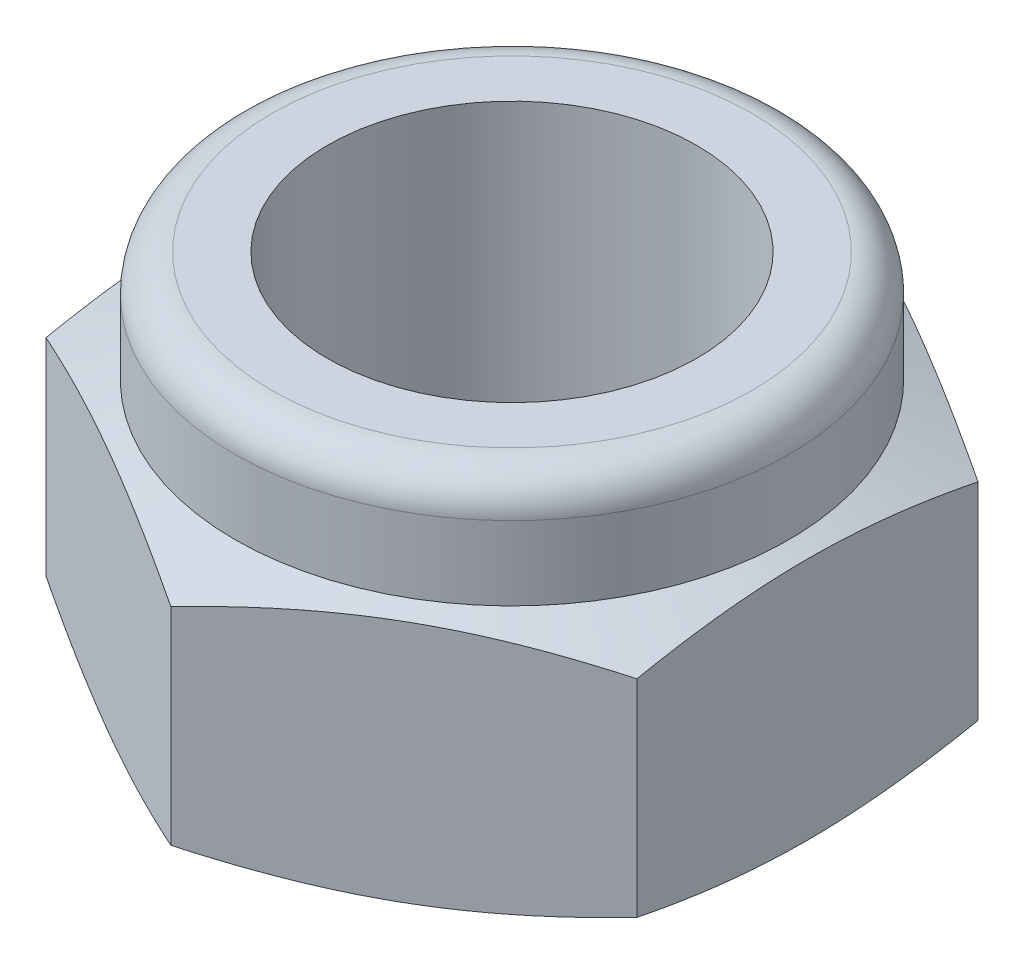
ISO-10303-21;
HEADER;
FILE_DESCRIPTION(('STEP AP214'),'2;1');
FILE_NAME('part.step','',(''),(''),'','','');
FILE_SCHEMA(('AUTOMOTIVE_DESIGN { 1 0 10303 214 1 1 1 1 }'));
ENDSEC;
DATA;
#1=APPLICATION_CONTEXT('core data for automotive mechanical design processes');
#2=APPLICATION_PROTOCOL_DEFINITION('international standard','automotive_design',2000,#1);
#3=PRODUCT_CONTEXT('',#1,'mechanical');
#4=PRODUCT('Part','Part','',(#3));
#5=PRODUCT_RELATED_PRODUCT_CATEGORY('part','',(#4));
#6=PRODUCT_DEFINITION_FORMATION('','',#4);
#7=PRODUCT_DEFINITION_CONTEXT('part definition',#1,'design');
#8=PRODUCT_DEFINITION('design','',#6,#7);
#9=PRODUCT_DEFINITION_SHAPE('','',#8);
#10=(LENGTH_UNIT() NAMED_UNIT(*) SI_UNIT(.MILLI.,.METRE.));
#11=(NAMED_UNIT(*) PLANE_ANGLE_UNIT() SI_UNIT($,.RADIAN.));
#12=(NAMED_UNIT(*) SI_UNIT($,.STERADIAN.) SOLID_ANGLE_UNIT());
#13=UNCERTAINTY_MEASURE_WITH_UNIT(LENGTH_MEASURE(1.E-05),#10,'distance_accuracy_value','');
#14=(GEOMETRIC_REPRESENTATION_CONTEXT(3) GLOBAL_UNCERTAINTY_ASSIGNED_CONTEXT((#13)) GLOBAL_UNIT_ASSIGNED_CONTEXT((#10,
#11,#12)) REPRESENTATION_CONTEXT('',''));
#15=CARTESIAN_POINT('',(0.,0.,0.));
#16=DIRECTION('',(0.,0.,1.));
#17=DIRECTION('',(1.,0.,0.));
#18=AXIS2_PLACEMENT_3D('',#15,#16,#17);
#19=CARTESIAN_POINT('',(0.,3.14687503180267,0.));
#20=DIRECTION('',(0.,-1.,0.));
#21=DIRECTION('',(0.,0.,-1.));
#22=AXIS2_PLACEMENT_3D('',#19,#20,#21);
#23=CONICAL_SURFACE('',#22,4.62401496633902,1.18682389133742);
#24=CARTESIAN_POINT('',(0.,3.5,0.));
#25=DIRECTION('',(0.,-1.,0.));
#26=DIRECTION('',(0.,0.,-1.));
#27=AXIS2_PLACEMENT_3D('',#24,#25,#26);
#28=CIRCLE('',#27,3.75);
#29=CARTESIAN_POINT('',(0.,3.5,-3.75));
#30=VERTEX_POINT('',#29);
#31=EDGE_CURVE('E229',#30,#30,#28,.F.);
#32=ORIENTED_EDGE('',*,*,#31,.F.);
#33=EDGE_LOOP('',(#32));
#34=FACE_BOUND('',#33,.T.);
#35=CARTESIAN_POINT('',(-4.,3.14898114489418,-2.30940107675388));
#36=CARTESIAN_POINT('',(-4.,3.18158156506634,-2.14803260388852));
#37=CARTESIAN_POINT('',(-4.,3.21172589764489,-1.98613151891979));
#38=CARTESIAN_POINT('',(-4.,3.26617589750299,-1.66125879722979));
#39=CARTESIAN_POINT('',(-4.,3.29047814372748,-1.49828659037453));
#40=CARTESIAN_POINT('',(-4.,3.33227097713042,-1.17150359830667));
#41=CARTESIAN_POINT('',(-4.,3.34976358624753,-1.00769307666777));
#42=CARTESIAN_POINT('',(-4.,3.37712650902647,-0.679463544558104));
#43=CARTESIAN_POINT('',(-4.,3.38699850195952,-0.515044676170488));
#44=CARTESIAN_POINT('',(-4.,3.39850629278675,-0.188709981569341));
#45=CARTESIAN_POINT('',(-4.,3.4002790967334,-0.0267990596989201));
#46=CARTESIAN_POINT('',(-4.,3.39586572436489,0.296927102716602));
#47=CARTESIAN_POINT('',(-4.,3.38967884833124,0.458742333598603));
#48=CARTESIAN_POINT('',(-4.,3.3696792951232,0.781778965489249));
#49=CARTESIAN_POINT('',(-4.,3.35587190856047,0.943000700453664));
#50=CARTESIAN_POINT('',(-4.,3.32129868657898,1.26469322812613));
#51=CARTESIAN_POINT('',(-4.,3.30053272777561,1.42516400746759));
#52=CARTESIAN_POINT('',(-4.,3.2677079996196,1.64569197902884));
#53=CARTESIAN_POINT('',(-4.,3.25826251207034,1.70615101770644));
#54=CARTESIAN_POINT('',(-4.,3.23854902310975,1.8269263991376));
#55=CARTESIAN_POINT('',(-4.,3.22828114561654,1.8872427619848));
#56=CARTESIAN_POINT('',(-4.,3.20693382795611,2.00794426480065));
#57=CARTESIAN_POINT('',(-4.,3.19585172794621,2.06832893246206));
#58=CARTESIAN_POINT('',(-4.,3.17295418156465,2.1889659652683));
#59=CARTESIAN_POINT('',(-4.,3.16113865560471,2.24921831531746));
#60=CARTESIAN_POINT('',(-4.,3.14898114489418,2.30940107675388));
#61=B_SPLINE_CURVE_WITH_KNOTS('',3,(#35,#36,#37,#38,#39,#40,#41,#42,#43,#44,#45,#46,#47,#48,#49,
#50,#51,#52,#53,#54,#55,#56,#57,#58,#59,#60),.UNSPECIFIED.,.F.,.F.,(4,2,2,2,2,2,2,2,2,2,2,2,4),
(0.,0.493920329972594,0.988129192967857,1.4821912017975,1.97614430852295,2.46170998161127,
2.94731834265934,3.43258998881883,3.91787023993664,4.10144403841557,4.28499022775614,
4.46916523344239,4.6533602600783),.UNSPECIFIED.);
#62=CARTESIAN_POINT('',(-4.,3.14898114489371,-2.30940107675619));
#63=VERTEX_POINT('',#62);
#64=CARTESIAN_POINT('',(-3.999999999998,3.14898114489371,2.30940107675966));
#65=VERTEX_POINT('',#64);
#66=EDGE_CURVE('E191',#63,#65,#61,.T.);
#67=ORIENTED_EDGE('',*,*,#66,.T.);
#68=CARTESIAN_POINT('',(-3.99999999999599,3.14898114489417,2.30940107676082));
#69=CARTESIAN_POINT('',(-3.8602508031247,3.18158156506634,2.3900853131935));
#70=CARTESIAN_POINT('',(-3.72004035064151,3.21172589764489,2.47103585567786));
#71=CARTESIAN_POINT('',(-3.43869232066138,3.26617589750299,2.63347221652286));
#72=CARTESIAN_POINT('',(-3.29755424941392,3.29047814372748,2.71495831995049));
#73=CARTESIAN_POINT('',(-3.01455187675847,3.33227097713042,2.87834981598442));
#74=CARTESIAN_POINT('',(-2.872687803612,3.34976358624753,2.96025507680386));
#75=CARTESIAN_POINT('',(-2.58843269053275,3.37712650902647,3.1243698428587));
#76=CARTESIAN_POINT('',(-2.44604177364759,3.38699850195951,3.2065792770525));
#77=CARTESIAN_POINT('',(-2.16342763798676,3.39850629278675,3.36974662435308));
#78=CARTESIAN_POINT('',(-2.02320866649681,3.4002790967334,3.45070208528829));
#79=CARTESIAN_POINT('',(-1.74285358597532,3.39586572436489,3.61256516649605));
#80=CARTESIAN_POINT('',(-1.60271748531226,3.38967884833124,3.69347278193705));
#81=CARTESIAN_POINT('',(-1.322959555742,3.3696792951232,3.85499109788238));
#82=CARTESIAN_POINT('',(-1.18333743762061,3.35587190856047,3.93560196536459));
#83=CARTESIAN_POINT('',(-0.904743536448626,3.32129868657898,4.09644822920082));
#84=CARTESIAN_POINT('',(-0.765771764973833,3.30053272777561,4.17668361887155));
#85=CARTESIAN_POINT('',(-0.574788939357452,3.26770799961972,4.28694760465176));
#86=CARTESIAN_POINT('',(-0.522429875974979,3.2582625120706,4.31717712399015));
#87=CARTESIAN_POINT('',(-0.417835327505256,3.2385490231103,4.37756481470491));
#88=CARTESIAN_POINT('',(-0.365599825016411,3.22828114561724,4.4077229961281));
#89=CARTESIAN_POINT('',(-0.26106925730435,3.20693382795714,4.46807374753521));
#90=CARTESIAN_POINT('',(-0.208774601111194,3.19585172794743,4.4982660813655));
#91=CARTESIAN_POINT('',(-0.104299866065236,3.17295418156624,4.5585845977678));
#92=CARTESIAN_POINT('',(-0.0521198002856577,3.16113865560649,4.58871077279197));
#93=CARTESIAN_POINT('',(-1.25242664107626E-11,3.14898114489616,4.61880215350978));
#94=B_SPLINE_CURVE_WITH_KNOTS('',3,(#68,#69,#70,#71,#72,#73,#74,#75,#76,#77,#78,#79,#80,#81,#82,
#83,#84,#85,#86,#87,#88,#89,#90,#91,#92,#93),.UNSPECIFIED.,.F.,.F.,(4,2,2,2,2,2,2,2,2,2,2,2,4),
(0.,0.493920329972588,0.988129192967845,1.48219120179748,1.97614430852293,2.46170998161125,
2.94731834265933,3.43258998881882,3.91787023993663,4.10144403841306,4.28499022775113,
4.46916523343486,4.65336026006826),.UNSPECIFIED.);
#95=CARTESIAN_POINT('',(6.19423875490116E-12,3.1489811448998,4.61880215351314));
#96=VERTEX_POINT('',#95);
#97=EDGE_CURVE('E197',#65,#96,#94,.T.);
#98=ORIENTED_EDGE('',*,*,#97,.T.);
#99=CARTESIAN_POINT('',(1.06646857327042E-11,3.14898114489294,4.61880215350559));
#100=CARTESIAN_POINT('',(0.139749196882781,3.18158156506697,4.53811791707581));
#101=CARTESIAN_POINT('',(0.279959649366109,3.2117258976462,4.45716737459275));
#102=CARTESIAN_POINT('',(0.561307679345923,3.26617589750457,4.29473101374894));
#103=CARTESIAN_POINT('',(0.702445750592923,3.29047814372867,4.21324491032121));
#104=CARTESIAN_POINT('',(0.985448123247574,3.33227097713113,4.04985341428748));
#105=CARTESIAN_POINT('',(1.1273121963937,3.34976358624815,3.96794815346832));
#106=CARTESIAN_POINT('',(1.41156730947224,3.37712650902687,3.80383338741397));
#107=CARTESIAN_POINT('',(1.55395822635703,3.38699850195979,3.72162395322036));
#108=CARTESIAN_POINT('',(1.8365723620171,3.39850629278682,3.5584566059202));
#109=CARTESIAN_POINT('',(1.97679133350666,3.4002790967334,3.47750114498522));
#110=CARTESIAN_POINT('',(2.25714641402738,3.39586572436479,3.31563806377791));
#111=CARTESIAN_POINT('',(2.39728251469004,3.38967884833111,3.23473044833713));
#112=CARTESIAN_POINT('',(2.67704044425954,3.36967929512305,3.07321213239225));
#113=CARTESIAN_POINT('',(2.81666256238054,3.35587190856034,2.99260126491026));
#114=CARTESIAN_POINT('',(3.09525646355177,3.32129868657892,2.83175500107446));
#115=CARTESIAN_POINT('',(3.23422823502619,3.3005327277756,2.75151961140395));
#116=CARTESIAN_POINT('',(3.42521106064294,3.26770799961965,2.64125562562353));
#117=CARTESIAN_POINT('',(3.47757012402615,3.25826251207039,2.61102610628471));
#118=CARTESIAN_POINT('',(3.58216467249736,3.23854902310979,2.55063841556909));
#119=CARTESIAN_POINT('',(3.63440017498694,3.22828114561658,2.52048023414548));
#120=CARTESIAN_POINT('',(3.73893074270048,3.20693382795614,2.46012948273752));
#121=CARTESIAN_POINT('',(3.79122539889437,3.19585172794624,2.4299371489068));
#122=CARTESIAN_POINT('',(3.89570013394181,3.17295418156467,2.36961863250364));
#123=CARTESIAN_POINT('',(3.94788019972213,3.16113865560471,2.33949245747905));
#124=CARTESIAN_POINT('',(3.999999999996,3.14898114489417,2.30940107676082));
#125=B_SPLINE_CURVE_WITH_KNOTS('',3,(#99,#100,#101,#102,#103,#104,#105,#106,#107,#108,#109,#110,
#111,#112,#113,#114,#115,#116,#117,#118,#119,#120,#121,#122,#123,#124),.UNSPECIFIED.,.F.,.F.,(4,
2,2,2,2,2,2,2,2,2,2,2,4),(0.,0.493920329971413,0.988129192965435,1.48219120179375,
1.97614430851791,2.4617099816049,2.94731834265163,3.4325899888098,3.9178702399263,
4.10144403840533,4.284990227746,4.46916523343235,4.65336026006837),.UNSPECIFIED.);
#126=CARTESIAN_POINT('',(4.,3.14898114489371,2.30940107675619));
#127=VERTEX_POINT('',#126);
#128=EDGE_CURVE('E93',#96,#127,#125,.T.);
#129=ORIENTED_EDGE('',*,*,#128,.T.);
#130=CARTESIAN_POINT('',(4.,3.14898114489417,2.30940107675388));
#131=CARTESIAN_POINT('',(4.,3.18158156506634,2.14803260388852));
#132=CARTESIAN_POINT('',(4.,3.21172589764489,1.98613151891979));
#133=CARTESIAN_POINT('',(4.,3.26617589750299,1.66125879722979));
#134=CARTESIAN_POINT('',(4.,3.29047814372748,1.49828659037453));
#135=CARTESIAN_POINT('',(4.,3.33227097713042,1.17150359830667));
#136=CARTESIAN_POINT('',(4.,3.34976358624753,1.00769307666778));
#137=CARTESIAN_POINT('',(4.,3.37712650902647,0.679463544558106));
#138=CARTESIAN_POINT('',(4.,3.38699850195952,0.51504467617049));
#139=CARTESIAN_POINT('',(4.,3.39850629278675,0.188709981569343));
#140=CARTESIAN_POINT('',(4.,3.4002790967334,0.0267990596989224));
#141=CARTESIAN_POINT('',(4.,3.39586572436489,-0.2969271027166));
#142=CARTESIAN_POINT('',(4.,3.38967884833124,-0.4587423335986));
#143=CARTESIAN_POINT('',(4.,3.3696792951232,-0.781778965489247));
#144=CARTESIAN_POINT('',(4.,3.35587190856047,-0.943000700453662));
#145=CARTESIAN_POINT('',(4.,3.32129868657898,-1.26469322812613));
#146=CARTESIAN_POINT('',(4.,3.30053272777561,-1.42516400746759));
#147=CARTESIAN_POINT('',(4.,3.2677079996196,-1.64569197902884));
#148=CARTESIAN_POINT('',(4.,3.25826251207034,-1.70615101770644));
#149=CARTESIAN_POINT('',(4.,3.23854902310975,-1.8269263991376));
#150=CARTESIAN_POINT('',(4.,3.22828114561654,-1.8872427619848));
#151=CARTESIAN_POINT('',(4.,3.20693382795611,-2.00794426480065));
#152=CARTESIAN_POINT('',(4.,3.19585172794621,-2.06832893246206));
#153=CARTESIAN_POINT('',(4.,3.17295418156465,-2.1889659652683));
#154=CARTESIAN_POINT('',(4.,3.16113865560471,-2.24921831531746));
#155=CARTESIAN_POINT('',(4.,3.14898114489418,-2.30940107675388));
#156=B_SPLINE_CURVE_WITH_KNOTS('',3,(#130,#131,#132,#133,#134,#135,#136,#137,#138,#139,#140,
#141,#142,#143,#144,#145,#146,#147,#148,#149,#150,#151,#152,#153,#154,#155),.UNSPECIFIED.,.F.,
.F.,(4,2,2,2,2,2,2,2,2,2,2,2,4),(0.,0.493920329972594,0.988129192967858,1.4821912017975,
1.97614430852295,2.46170998161127,2.94731834265934,3.43258998881883,3.91787023993664,
4.10144403841557,4.28499022775614,4.46916523344239,4.6533602600783),.UNSPECIFIED.);
#157=CARTESIAN_POINT('',(3.999999999998,3.14898114489371,-2.30940107675966));
#158=VERTEX_POINT('',#157);
#159=EDGE_CURVE('E86',#127,#158,#156,.T.);
#160=ORIENTED_EDGE('',*,*,#159,.T.);
#161=CARTESIAN_POINT('',(3.99999999999599,3.14898114489417,-2.30940107676082));
#162=CARTESIAN_POINT('',(3.86025080312469,3.18158156506634,-2.3900853131935));
#163=CARTESIAN_POINT('',(3.72004035064151,3.21172589764489,-2.47103585567786));
#164=CARTESIAN_POINT('',(3.43869232066138,3.26617589750299,-2.63347221652286));
#165=CARTESIAN_POINT('',(3.29755424941392,3.29047814372748,-2.71495831995049));
#166=CARTESIAN_POINT('',(3.01455187675847,3.33227097713042,-2.87834981598442));
#167=CARTESIAN_POINT('',(2.872687803612,3.34976358624753,-2.96025507680386));
#168=CARTESIAN_POINT('',(2.58843269053275,3.37712650902647,-3.1243698428587));
#169=CARTESIAN_POINT('',(2.44604177364759,3.38699850195951,-3.20657927705251));
#170=CARTESIAN_POINT('',(2.16342763798676,3.39850629278675,-3.36974662435308));
#171=CARTESIAN_POINT('',(2.02320866649681,3.4002790967334,-3.45070208528829));
#172=CARTESIAN_POINT('',(1.74285358597532,3.39586572436489,-3.61256516649605));
#173=CARTESIAN_POINT('',(1.60271748531226,3.38967884833124,-3.69347278193705));
#174=CARTESIAN_POINT('',(1.322959555742,3.3696792951232,-3.85499109788238));
#175=CARTESIAN_POINT('',(1.18333743762061,3.35587190856047,-3.93560196536459));
#176=CARTESIAN_POINT('',(0.904743536448625,3.32129868657898,-4.09644822920082));
#177=CARTESIAN_POINT('',(0.765771764973832,3.30053272777561,-4.17668361887155));
#178=CARTESIAN_POINT('',(0.574788939357451,3.26770799961972,-4.28694760465176));
#179=CARTESIAN_POINT('',(0.522429875974978,3.2582625120706,-4.31717712399015));
#180=CARTESIAN_POINT('',(0.417835327505255,3.2385490231103,-4.37756481470491));
#181=CARTESIAN_POINT('',(0.365599825016411,3.22828114561724,-4.4077229961281));
#182=CARTESIAN_POINT('',(0.26106925730435,3.20693382795714,-4.46807374753521));
#183=CARTESIAN_POINT('',(0.208774601111195,3.19585172794743,-4.4982660813655));
#184=CARTESIAN_POINT('',(0.104299866065238,3.17295418156624,-4.5585845977678));
#185=CARTESIAN_POINT('',(0.0521198002856595,3.16113865560649,-4.58871077279197));
#186=CARTESIAN_POINT('',(1.25258519672917E-11,3.14898114489616,-4.61880215350978));
#187=B_SPLINE_CURVE_WITH_KNOTS('',3,(#161,#162,#163,#164,#165,#166,#167,#168,#169,#170,#171,
#172,#173,#174,#175,#176,#177,#178,#179,#180,#181,#182,#183,#184,#185,#186),.UNSPECIFIED.,.F.,
.F.,(4,2,2,2,2,2,2,2,2,2,2,2,4),(0.,0.493920329972589,0.988129192967846,1.48219120179748,
1.97614430852293,2.46170998161126,2.94731834265933,3.43258998881882,3.91787023993664,
4.10144403841306,4.28499022775113,4.46916523343486,4.65336026006826),.UNSPECIFIED.);
#188=CARTESIAN_POINT('',(0.,3.14898114489613,-4.61880215350986));
#189=VERTEX_POINT('',#188);
#190=EDGE_CURVE('E76',#158,#189,#187,.T.);
#191=ORIENTED_EDGE('',*,*,#190,.T.);
#192=CARTESIAN_POINT('',(-1.06628863975872E-11,3.14898114489294,-4.61880215350559));
#193=CARTESIAN_POINT('',(-0.139749196882779,3.18158156506697,-4.53811791707581));
#194=CARTESIAN_POINT('',(-0.279959649366107,3.21172589764619,-4.45716737459275));
#195=CARTESIAN_POINT('',(-0.561307679345921,3.26617589750457,-4.29473101374895));
#196=CARTESIAN_POINT('',(-0.702445750592921,3.29047814372867,-4.21324491032121));
#197=CARTESIAN_POINT('',(-0.985448123247572,3.33227097713113,-4.04985341428748));
#198=CARTESIAN_POINT('',(-1.1273121963937,3.34976358624815,-3.96794815346832));
#199=CARTESIAN_POINT('',(-1.41156730947224,3.37712650902687,-3.80383338741397));
#200=CARTESIAN_POINT('',(-1.55395822635703,3.38699850195979,-3.72162395322036));
#201=CARTESIAN_POINT('',(-1.83657236201709,3.39850629278682,-3.5584566059202));
#202=CARTESIAN_POINT('',(-1.97679133350666,3.4002790967334,-3.47750114498522));
#203=CARTESIAN_POINT('',(-2.25714641402737,3.39586572436479,-3.31563806377791));
#204=CARTESIAN_POINT('',(-2.39728251469004,3.38967884833111,-3.23473044833713));
#205=CARTESIAN_POINT('',(-2.67704044425953,3.36967929512305,-3.07321213239225));
#206=CARTESIAN_POINT('',(-2.81666256238054,3.35587190856034,-2.99260126491026));
#207=CARTESIAN_POINT('',(-3.09525646355177,3.32129868657892,-2.83175500107447));
#208=CARTESIAN_POINT('',(-3.23422823502619,3.3005327277756,-2.75151961140395));
#209=CARTESIAN_POINT('',(-3.42521106064294,3.26770799961966,-2.64125562562353));
#210=CARTESIAN_POINT('',(-3.47757012402615,3.25826251207039,-2.61102610628471));
#211=CARTESIAN_POINT('',(-3.58216467249736,3.23854902310979,-2.55063841556909));
#212=CARTESIAN_POINT('',(-3.63440017498694,3.22828114561658,-2.52048023414548));
#213=CARTESIAN_POINT('',(-3.73893074270048,3.20693382795614,-2.46012948273752));
#214=CARTESIAN_POINT('',(-3.79122539889438,3.19585172794624,-2.4299371489068));
#215=CARTESIAN_POINT('',(-3.89570013394181,3.17295418156467,-2.36961863250364));
#216=CARTESIAN_POINT('',(-3.94788019972213,3.16113865560471,-2.33949245747905));
#217=CARTESIAN_POINT('',(-3.999999999996,3.14898114489417,-2.30940107676082));
#218=B_SPLINE_CURVE_WITH_KNOTS('',3,(#192,#193,#194,#195,#196,#197,#198,#199,#200,#201,#202,
#203,#204,#205,#206,#207,#208,#209,#210,#211,#212,#213,#214,#215,#216,#217),.UNSPECIFIED.,.F.,
.F.,(4,2,2,2,2,2,2,2,2,2,2,2,4),(0.,0.493920329971412,0.988129192965434,1.48219120179375,
1.97614430851791,2.46170998160489,2.94731834265163,3.4325899888098,3.9178702399263,
4.10144403840533,4.284990227746,4.46916523343236,4.65336026006838),.UNSPECIFIED.);
#219=EDGE_CURVE('E183',#189,#63,#218,.T.);
#220=ORIENTED_EDGE('',*,*,#219,.T.);
#221=EDGE_LOOP('',(#67,#98,#129,#160,#191,#220));
#222=FACE_BOUND('',#221,.T.);
#223=ADVANCED_FACE('F16',(#34,#222),#23,.T.);
#224=CARTESIAN_POINT('',(4.,5.,-2.30940107675851));
#225=DIRECTION('',(-0.5,0.,0.866025403784439));
#226=DIRECTION('',(0.866025403784439,0.,0.5));
#227=AXIS2_PLACEMENT_3D('',#224,#225,#226);
#228=PLANE('',#227);
#229=CARTESIAN_POINT('',(1.72077175831445E-11,0.351018855102318,-4.61880215349227));
#230=CARTESIAN_POINT('',(0.13974919688429,0.318418434928457,-4.53811791707151));
#231=CARTESIAN_POINT('',(0.279959649361267,0.288274102351217,-4.45716737459462));
#232=CARTESIAN_POINT('',(0.561307679327136,0.233824102497748,-4.29473101376071));
#233=CARTESIAN_POINT('',(0.702445750566544,0.209521856276568,-4.21324491033669));
#234=CARTESIAN_POINT('',(0.985448123212632,0.167729022877266,-4.0498534143074));
#235=CARTESIAN_POINT('',(1.12731219635783,0.150236413760786,-3.96794815348897));
#236=CARTESIAN_POINT('',(1.41156730943431,0.122873490982645,-3.80383338743593));
#237=CARTESIAN_POINT('',(1.55395822631798,0.113001498049758,-3.72162395324291));
#238=CARTESIAN_POINT('',(1.83657236200003,0.101493707221089,-3.55845660593004));
#239=CARTESIAN_POINT('',(1.97679133351272,0.0997209032742212,-3.47750114498171));
#240=CARTESIAN_POINT('',(2.2571464140799,0.104134275644371,-3.31563806374759));
#241=CARTESIAN_POINT('',(2.39728251476588,0.110321151679896,-3.23473044829334));
#242=CARTESIAN_POINT('',(2.67704044437802,0.130320704893299,-3.07321213232384));
#243=CARTESIAN_POINT('',(2.81666256251836,0.144128091459315,-2.99260126483069));
#244=CARTESIAN_POINT('',(3.09525646372763,0.178701313448477,-2.83175500097293));
#245=CARTESIAN_POINT('',(3.23422823522077,0.199467272256194,-2.75151961129161));
#246=CARTESIAN_POINT('',(3.42521105410597,0.232291999257489,-2.64125562939765));
#247=CARTESIAN_POINT('',(3.47757011075463,0.241737485534901,-2.61102611394703));
#248=CARTESIAN_POINT('',(3.58216464578857,0.261450971746062,-2.55063843098942));
#249=CARTESIAN_POINT('',(3.63440014157543,0.271718847761729,-2.52048025343562));
#250=CARTESIAN_POINT('',(3.73893069586666,0.29306616226941,-2.46012950977704));
#251=CARTESIAN_POINT('',(3.79122534534112,0.304148260603073,-2.42993717982578));
#252=CARTESIAN_POINT('',(3.89570006698021,0.327045803461147,-2.36961867116394));
#253=CARTESIAN_POINT('',(3.94788012607162,0.338861327573819,-2.33949250000119));
#254=CARTESIAN_POINT('',(3.99999991967198,0.351018836360798,-2.30940112313591));
#255=B_SPLINE_CURVE_WITH_KNOTS('',3,(#229,#230,#231,#232,#233,#234,#235,#236,#237,#238,#239,
#240,#241,#242,#243,#244,#245,#246,#247,#248,#249,#250,#251,#252,#253,#254),.UNSPECIFIED.,.F.,
.F.,(4,2,2,2,2,2,2,2,2,2,2,2,4),(0.,0.49392032994503,0.988129192912733,1.48219120173744,
1.97614430845782,2.46170998162488,2.9473183427524,3.43258998897841,3.91787024015975,
4.10144401500207,4.28499018071136,4.46916516259711,4.6533601654304),.UNSPECIFIED.);
#256=CARTESIAN_POINT('',(0.,0.351018855040937,-4.61880215345987));
#257=VERTEX_POINT('',#256);
#258=CARTESIAN_POINT('',(3.99999995983602,0.351018845729649,-2.30940109994719));
#259=VERTEX_POINT('',#258);
#260=EDGE_CURVE('E131',#257,#259,#255,.T.);
#261=ORIENTED_EDGE('',*,*,#260,.F.);
#262=DIRECTION('',(0.,1.,0.));
#263=VECTOR('',#262,1.);
#264=CARTESIAN_POINT('',(0.,5.,-4.61880215351701));
#265=LINE('',#264,#263);
#266=EDGE_CURVE('E82',#257,#189,#265,.T.);
#267=ORIENTED_EDGE('',*,*,#266,.T.);
#268=ORIENTED_EDGE('',*,*,#190,.F.);
#269=DIRECTION('',(0.,1.,0.));
#270=VECTOR('',#269,1.);
#271=CARTESIAN_POINT('',(4.,5.,-2.30940107675851));
#272=LINE('',#271,#270);
#273=EDGE_CURVE('E80',#158,#259,#272,.F.);
#274=ORIENTED_EDGE('',*,*,#273,.T.);
#275=EDGE_LOOP('',(#261,#267,#268,#274));
#276=FACE_BOUND('',#275,.T.);
#277=ADVANCED_FACE('F79',(#276),#228,.F.);
#278=CARTESIAN_POINT('',(4.,5.,2.30940107675851));
#279=DIRECTION('',(-1.,0.,0.));
#280=DIRECTION('',(0.,0.,1.));
#281=AXIS2_PLACEMENT_3D('',#278,#279,#280);
#282=PLANE('',#281);
#283=CARTESIAN_POINT('',(3.99999995983838,0.351018891478303,-2.30940111198666));
#284=CARTESIAN_POINT('',(3.99999998557365,0.318418452778363,-2.14803264233142));
#285=CARTESIAN_POINT('',(3.99999999613347,0.288274112296756,-1.98613155859903));
#286=CARTESIAN_POINT('',(4.00000000386878,0.233824105998727,-1.66125883779693));
#287=CARTESIAN_POINT('',(4.00000000103644,0.20952186123689,-1.4982866305932));
#288=CARTESIAN_POINT('',(3.99999999896386,0.167729028190791,-1.17150363847354));
#289=CARTESIAN_POINT('',(3.99999999972255,0.150236417960629,-1.00769311713222));
#290=CARTESIAN_POINT('',(4.00000000027738,0.122873493555329,-0.679463585397672));
#291=CARTESIAN_POINT('',(4.00000000007373,0.113001500112131,-0.515044717087347));
#292=CARTESIAN_POINT('',(3.99999999992752,0.101493708068084,-0.188710022907259));
#293=CARTESIAN_POINT('',(3.99999999998058,0.0997209034054708,-0.0267991013810474));
#294=CARTESIAN_POINT('',(4.00000000001942,0.104134274366119,0.296927060349101));
#295=CARTESIAN_POINT('',(4.00000000000519,0.110321149705894,0.458742290889967));
#296=CARTESIAN_POINT('',(3.99999999999481,0.130320701528934,0.781778922199564));
#297=CARTESIAN_POINT('',(3.99999999999865,0.144128087403918,0.943000656923831));
#298=CARTESIAN_POINT('',(4.00000000000135,0.178701308058499,1.26469318413832));
#299=CARTESIAN_POINT('',(4.00000000000021,0.199467266222642,1.42516396326195));
#300=CARTESIAN_POINT('',(3.99999999999992,0.232291992946456,1.64569193055546));
#301=CARTESIAN_POINT('',(3.99999999999998,0.241737479620192,1.706150965187));
#302=CARTESIAN_POINT('',(4.00000000000002,0.26145096673312,1.82692633854192));
#303=CARTESIAN_POINT('',(4.00000000000001,0.271718843254151,1.88724269735892));
#304=CARTESIAN_POINT('',(3.99999999999999,0.293066158880471,2.00794419212058));
#305=CARTESIAN_POINT('',(4.,0.304148257828139,2.06832885575806));
#306=CARTESIAN_POINT('',(4.,0.327045802008394,2.18896588053965));
#307=CARTESIAN_POINT('',(4.00000000000001,0.338861326829308,2.24921822658807));
#308=CARTESIAN_POINT('',(4.,0.351018836366694,2.30940098403288));
#309=B_SPLINE_CURVE_WITH_KNOTS('',3,(#283,#284,#285,#286,#287,#288,#289,#290,#291,#292,#293,
#294,#295,#296,#297,#298,#299,#300,#301,#302,#303,#304,#305,#306,#307,#308),.UNSPECIFIED.,.F.,
.F.,(4,2,2,2,2,2,2,2,2,2,2,2,4),(0.,0.493920330647644,0.988129193819224,1.48219120224387,
1.97614430877818,2.46170998087862,2.94731834081774,3.43258998608402,3.91787023630369,
4.10144402238539,4.28499019931831,4.46916519255653,4.65336020675775),.UNSPECIFIED.);
#310=CARTESIAN_POINT('',(4.,0.35101884573263,2.30940103039589));
#311=VERTEX_POINT('',#310);
#312=EDGE_CURVE('E92',#259,#311,#309,.T.);
#313=ORIENTED_EDGE('',*,*,#312,.F.);
#314=ORIENTED_EDGE('',*,*,#273,.F.);
#315=ORIENTED_EDGE('',*,*,#159,.F.);
#316=DIRECTION('',(0.,1.,0.));
#317=VECTOR('',#316,1.);
#318=CARTESIAN_POINT('',(4.,5.,2.30940107675851));
#319=LINE('',#318,#317);
#320=EDGE_CURVE('E202',#127,#311,#319,.F.);
#321=ORIENTED_EDGE('',*,*,#320,.T.);
#322=EDGE_LOOP('',(#313,#314,#315,#321));
#323=FACE_BOUND('',#322,.T.);
#324=ADVANCED_FACE('F89',(#323),#282,.F.);
#325=CARTESIAN_POINT('',(0.,5.,4.61880215351701));
#326=DIRECTION('',(-0.5,0.,-0.866025403784439));
#327=DIRECTION('',(-0.866025403784439,0.,0.5));
#328=AXIS2_PLACEMENT_3D('',#325,#326,#327);
#329=PLANE('',#328);
#330=CARTESIAN_POINT('',(4.00000001040763,0.351018891466139,2.30940102438525));
#331=CARTESIAN_POINT('',(3.86025082916525,0.31841845276693,2.39008528150454));
#332=CARTESIAN_POINT('',(3.72004038301586,0.288274112284269,2.47103583252283));
#333=CARTESIAN_POINT('',(3.43869235764034,0.233824105983498,2.63347219963935));
#334=CARTESIAN_POINT('',(3.29755428465975,0.20952186121997,2.71495830079782));
#335=CARTESIAN_POINT('',(3.01455191089878,0.167729028173758,2.87834979507734));
#336=CARTESIAN_POINT('',(2.87268783838021,0.150236417944855,2.96025505641013));
#337=CARTESIAN_POINT('',(2.58843272588503,0.122873493543111,3.12436982276828));
#338=CARTESIAN_POINT('',(2.44604180895592,0.113001500102212,3.20657925675235));
#339=CARTESIAN_POINT('',(2.16342767359264,0.101493708064876,3.36974660371234));
#340=CARTESIAN_POINT('',(2.02320870244242,0.0997209034053134,3.45070206451267));
#341=CARTESIAN_POINT('',(1.74285362256443,0.104134274370284,3.61256514539374));
#342=CARTESIAN_POINT('',(1.60271752220511,0.11032114971132,3.69347276064295));
#343=CARTESIAN_POINT('',(1.3229595931598,0.130320701535383,3.85499107627321));
#344=CARTESIAN_POINT('',(1.18333747525985,0.144128087410336,3.93560194363201));
#345=CARTESIAN_POINT('',(0.904743574508369,0.178701308063692,4.09644820722858));
#346=CARTESIAN_POINT('',(0.765771803232653,0.199467266226684,4.17668359678305));
#347=CARTESIAN_POINT('',(0.574788974594832,0.232291994105123,4.28694758430737));
#348=CARTESIAN_POINT('',(0.522429908003725,0.241737482047077,4.31717710549832));
#349=CARTESIAN_POINT('',(0.417835353134708,0.261450971901367,4.37756479990777));
#350=CARTESIAN_POINT('',(0.365599847455193,0.271718849895503,4.40772298317307));
#351=CARTESIAN_POINT('',(0.261069273339607,0.293066168664927,4.46807373827724));
#352=CARTESIAN_POINT('',(0.208774613933706,0.304148269283607,4.49826607396242));
#353=CARTESIAN_POINT('',(0.104299872472568,0.32704581697623,4.55858459406853));
#354=CARTESIAN_POINT('',(0.0521198034905666,0.338861343638518,4.58871077094163));
#355=CARTESIAN_POINT('',(2.24499685631197E-11,0.35101885509325,4.61880215350405));
#356=B_SPLINE_CURVE_WITH_KNOTS('',3,(#330,#331,#332,#333,#334,#335,#336,#337,#338,#339,#340,
#341,#342,#343,#344,#345,#346,#347,#348,#349,#350,#351,#352,#353,#354,#355),.UNSPECIFIED.,.F.,
.F.,(4,2,2,2,2,2,2,2,2,2,2,2,4),(0.,0.493920330701487,0.988129193926869,1.48219120238229,
1.97614430894753,2.46170998099559,2.94731834088162,3.43258998610783,3.91787023629041,
4.10144404592972,4.28499024641493,4.46916526337402,4.65336030129823),.UNSPECIFIED.);
#357=CARTESIAN_POINT('',(0.,0.351018855099028,4.61880215354456));
#358=VERTEX_POINT('',#357);
#359=EDGE_CURVE('E130',#311,#358,#356,.T.);
#360=ORIENTED_EDGE('',*,*,#359,.F.);
#361=ORIENTED_EDGE('',*,*,#320,.F.);
#362=ORIENTED_EDGE('',*,*,#128,.F.);
#363=DIRECTION('',(0.,1.,0.));
#364=VECTOR('',#363,1.);
#365=CARTESIAN_POINT('',(0.,5.,4.61880215351701));
#366=LINE('',#365,#364);
#367=EDGE_CURVE('E196',#96,#358,#366,.F.);
#368=ORIENTED_EDGE('',*,*,#367,.T.);
#369=EDGE_LOOP('',(#360,#361,#362,#368));
#370=FACE_BOUND('',#369,.T.);
#371=ADVANCED_FACE('F117',(#370),#329,.F.);
#372=CARTESIAN_POINT('',(-4.,5.,2.30940107675851));
#373=DIRECTION('',(0.5,0.,-0.866025403784439));
#374=DIRECTION('',(-0.866025403784439,0.,-0.5));
#375=AXIS2_PLACEMENT_3D('',#372,#373,#374);
#376=PLANE('',#375);
#377=CARTESIAN_POINT('',(-1.72065955580777E-11,0.351018855102319,4.61880215349227));
#378=CARTESIAN_POINT('',(-0.13974919688429,0.318418434928457,4.53811791707151));
#379=CARTESIAN_POINT('',(-0.279959649361268,0.288274102351217,4.45716737459462));
#380=CARTESIAN_POINT('',(-0.561307679327139,0.233824102497748,4.29473101376071));
#381=CARTESIAN_POINT('',(-0.702445750566547,0.209521856276567,4.21324491033668));
#382=CARTESIAN_POINT('',(-0.985448123212637,0.167729022877265,4.0498534143074));
#383=CARTESIAN_POINT('',(-1.12731219635783,0.150236413760786,3.96794815348896));
#384=CARTESIAN_POINT('',(-1.41156730943432,0.122873490982645,3.80383338743593));
#385=CARTESIAN_POINT('',(-1.55395822631799,0.113001498049758,3.72162395324291));
#386=CARTESIAN_POINT('',(-1.83657236200004,0.101493707221089,3.55845660593003));
#387=CARTESIAN_POINT('',(-1.97679133351273,0.0997209032742211,3.47750114498171));
#388=CARTESIAN_POINT('',(-2.2571464140799,0.104134275644371,3.31563806374759));
#389=CARTESIAN_POINT('',(-2.39728251476589,0.110321151679896,3.23473044829334));
#390=CARTESIAN_POINT('',(-2.67704044437802,0.130320704893299,3.07321213232384));
#391=CARTESIAN_POINT('',(-2.81666256251836,0.144128091459315,2.99260126483069));
#392=CARTESIAN_POINT('',(-3.09525646372763,0.178701313448477,2.83175500097293));
#393=CARTESIAN_POINT('',(-3.23422823522077,0.199467272256195,2.75151961129161));
#394=CARTESIAN_POINT('',(-3.42521105410639,0.232291999257563,2.6412556293974));
#395=CARTESIAN_POINT('',(-3.47757011075548,0.241737485535056,2.61102611394653));
#396=CARTESIAN_POINT('',(-3.58216464579028,0.261450971746391,2.55063843098843));
#397=CARTESIAN_POINT('',(-3.63440014157757,0.271718847762152,2.52048025343439));
#398=CARTESIAN_POINT('',(-3.73893069586965,0.293066162270033,2.46012950977531));
#399=CARTESIAN_POINT('',(-3.79122534534454,0.304148260603802,2.42993717982381));
#400=CARTESIAN_POINT('',(-3.89570006698448,0.3270458034621,2.36961867116148));
#401=CARTESIAN_POINT('',(-3.94788012607631,0.33886132757489,2.33949249999848));
#402=CARTESIAN_POINT('',(-3.99999991967709,0.351018836361991,2.30940112313296));
#403=B_SPLINE_CURVE_WITH_KNOTS('',3,(#377,#378,#379,#380,#381,#382,#383,#384,#385,#386,#387,
#388,#389,#390,#391,#392,#393,#394,#395,#396,#397,#398,#399,#400,#401,#402),.UNSPECIFIED.,.F.,
.F.,(4,2,2,2,2,2,2,2,2,2,2,2,4),(0.,0.493920329945034,0.98812919291274,1.48219120173745,
1.97614430845783,2.46170998162489,2.94731834275241,3.43258998897841,3.91787024015975,
4.10144401500357,4.28499018071437,4.46916516260162,4.65336016543642),.UNSPECIFIED.);
#404=CARTESIAN_POINT('',(-3.9999999598386,0.351018845730252,2.3094010999457));
#405=VERTEX_POINT('',#404);
#406=EDGE_CURVE('E208',#358,#405,#403,.T.);
#407=ORIENTED_EDGE('',*,*,#406,.F.);
#408=ORIENTED_EDGE('',*,*,#367,.F.);
#409=ORIENTED_EDGE('',*,*,#97,.F.);
#410=DIRECTION('',(0.,1.,0.));
#411=VECTOR('',#410,1.);
#412=CARTESIAN_POINT('',(-4.,5.,2.30940107675851));
#413=LINE('',#412,#411);
#414=EDGE_CURVE('E190',#65,#405,#413,.F.);
#415=ORIENTED_EDGE('',*,*,#414,.T.);
#416=EDGE_LOOP('',(#407,#408,#409,#415));
#417=FACE_BOUND('',#416,.T.);
#418=ADVANCED_FACE('F203',(#417),#376,.F.);
#419=CARTESIAN_POINT('',(-4.,5.,-2.3094010767585));
#420=DIRECTION('',(1.,0.,0.));
#421=DIRECTION('',(0.,0.,-1.));
#422=AXIS2_PLACEMENT_3D('',#419,#420,#421);
#423=PLANE('',#422);
#424=CARTESIAN_POINT('',(-3.99999995984018,0.351018891475842,2.30940111198094));
#425=CARTESIAN_POINT('',(-3.99999998557429,0.318418452776794,2.14803264232567));
#426=CARTESIAN_POINT('',(-3.99999999613365,0.288274112295606,1.98613155859333));
#427=CARTESIAN_POINT('',(-4.00000000386861,0.233824105997996,1.66125883779141));
#428=CARTESIAN_POINT('',(-4.0000000010364,0.209521861236158,1.4982866305878));
#429=CARTESIAN_POINT('',(-3.99999999896391,0.167729028190171,1.17150363846837));
#430=CARTESIAN_POINT('',(-3.99999999972257,0.150236417960121,1.00769311712715));
#431=CARTESIAN_POINT('',(-4.00000000027737,0.122873493555011,0.679463585392816));
#432=CARTESIAN_POINT('',(-4.00000000007373,0.11300150011189,0.515044717082606));
#433=CARTESIAN_POINT('',(-3.99999999992752,0.101493708067997,0.188710022902735));
#434=CARTESIAN_POINT('',(-3.99999999998058,0.0997209034054602,0.0267991013766272));
#435=CARTESIAN_POINT('',(-4.00000000001942,0.104134274366247,-0.296927060353312));
#436=CARTESIAN_POINT('',(-4.00000000000519,0.110321149706085,-0.458742290894072));
#437=CARTESIAN_POINT('',(-3.99999999999481,0.130320701529237,-0.781778922203454));
#438=CARTESIAN_POINT('',(-3.99999999999865,0.144128087404271,-0.943000656927612));
#439=CARTESIAN_POINT('',(-4.00000000000135,0.178701308058935,-1.26469318414188));
#440=CARTESIAN_POINT('',(-4.00000000000021,0.199467266223113,-1.42516396326541));
#441=CARTESIAN_POINT('',(-3.99999999999992,0.232291992947223,-1.6456919305605));
#442=CARTESIAN_POINT('',(-3.99999999999998,0.241737479621254,-1.70615096519375));
#443=CARTESIAN_POINT('',(-4.00000000000002,0.261450966734814,-1.82692633855205));
#444=CARTESIAN_POINT('',(-4.00000000000001,0.271718843256183,-1.88724269737074));
#445=CARTESIAN_POINT('',(-3.99999999999999,0.293066158883222,-2.00794419213579));
#446=CARTESIAN_POINT('',(-4.,0.30414825783127,-2.06832885577497));
#447=CARTESIAN_POINT('',(-4.,0.327045802012323,-2.18896588055994));
#448=CARTESIAN_POINT('',(-4.00000000000001,0.338861326833654,-2.24921822661005));
#449=CARTESIAN_POINT('',(-4.,0.351018836371473,-2.30940098405654));
#450=B_SPLINE_CURVE_WITH_KNOTS('',3,(#424,#425,#426,#427,#428,#429,#430,#431,#432,#433,#434,
#435,#436,#437,#438,#439,#440,#441,#442,#443,#444,#445,#446,#447,#448,#449),.UNSPECIFIED.,.F.,
.F.,(4,2,2,2,2,2,2,2,2,2,2,2,4),(0.,0.493920330647262,0.988129193818482,1.48219120224279,
1.97614430877675,2.46170998087687,2.94731834081568,3.43258998608164,3.917870236301,
4.10144402238788,4.28499019932597,4.4691651925694,4.65336020677582),.UNSPECIFIED.);
#451=CARTESIAN_POINT('',(-4.,0.351018845734981,-2.30940103040752));
#452=VERTEX_POINT('',#451);
#453=EDGE_CURVE('E156',#405,#452,#450,.T.);
#454=ORIENTED_EDGE('',*,*,#453,.F.);
#455=ORIENTED_EDGE('',*,*,#414,.F.);
#456=ORIENTED_EDGE('',*,*,#66,.F.);
#457=DIRECTION('',(0.,1.,0.));
#458=VECTOR('',#457,1.);
#459=CARTESIAN_POINT('',(-4.,5.,-2.30940107675851));
#460=LINE('',#459,#458);
#461=EDGE_CURVE('E189',#63,#452,#460,.F.);
#462=ORIENTED_EDGE('',*,*,#461,.T.);
#463=EDGE_LOOP('',(#454,#455,#456,#462));
#464=FACE_BOUND('',#463,.T.);
#465=ADVANCED_FACE('F179',(#464),#423,.F.);
#466=CARTESIAN_POINT('',(0.,5.,-4.61880215351701));
#467=DIRECTION('',(0.5,0.,0.866025403784439));
#468=DIRECTION('',(0.866025403784439,0.,-0.5));
#469=AXIS2_PLACEMENT_3D('',#466,#467,#468);
#470=PLANE('',#469);
#471=CARTESIAN_POINT('',(-4.00000001044284,0.351018891458352,-2.30940102438679));
#472=CARTESIAN_POINT('',(-3.86025082919201,0.318418452767137,-2.39008528149694));
#473=CARTESIAN_POINT('',(-3.72004038303856,0.288274112287459,-2.47103583251183));
#474=CARTESIAN_POINT('',(-3.43869235765867,0.23382410598825,-2.63347219962666));
#475=CARTESIAN_POINT('',(-3.29755428467779,0.209521861223303,-2.71495830078684));
#476=CARTESIAN_POINT('',(-3.0145519109151,0.167729028175502,-2.87834979506848));
#477=CARTESIAN_POINT('',(-2.8726878383951,0.150236417946432,-2.96025505640169));
#478=CARTESIAN_POINT('',(-2.58843272589733,0.122873493544152,-3.12436982276102));
#479=CARTESIAN_POINT('',(-2.44604180896708,0.11300150010288,-3.20657925674587));
#480=CARTESIAN_POINT('',(-2.16342767360136,0.101493708065021,-3.36974660370734));
#481=CARTESIAN_POINT('',(-2.02320870244985,0.0997209034053062,-3.45070206450839));
#482=CARTESIAN_POINT('',(-1.74285362256928,0.104134274370098,-3.61256514539093));
#483=CARTESIAN_POINT('',(-1.60271752220867,0.110321149711108,-3.69347276064089));
#484=CARTESIAN_POINT('',(-1.32295959316083,0.130320701535266,-3.85499107627262));
#485=CARTESIAN_POINT('',(-1.18333747525963,0.144128087410338,-3.93560194363214));
#486=CARTESIAN_POINT('',(-0.904743574505664,0.178701308064052,-4.09644820723014));
#487=CARTESIAN_POINT('',(-0.765771803228712,0.199467266227283,-4.17668359678532));
#488=CARTESIAN_POINT('',(-0.574788974590093,0.232291994105967,-4.2869475843101));
#489=CARTESIAN_POINT('',(-0.522429907999418,0.241737482047868,-4.31717710550081));
#490=CARTESIAN_POINT('',(-0.417835353131258,0.261450971902038,-4.37756479990976));
#491=CARTESIAN_POINT('',(-0.36559984745217,0.271718849896107,-4.40772298317482));
#492=CARTESIAN_POINT('',(-0.261069273337443,0.293066168665383,-4.46807373827849));
#493=CARTESIAN_POINT('',(-0.208774613931974,0.30414826928398,-4.49826607396342));
#494=CARTESIAN_POINT('',(-0.104299872471702,0.327045816976426,-4.55858459406903));
#495=CARTESIAN_POINT('',(-0.0521198034901337,0.338861343638619,-4.58871077094188));
#496=CARTESIAN_POINT('',(-2.24492152641146E-11,0.351018855093251,-4.61880215350405));
#497=B_SPLINE_CURVE_WITH_KNOTS('',3,(#471,#472,#473,#474,#475,#476,#477,#478,#479,#480,#481,
#482,#483,#484,#485,#486,#487,#488,#489,#490,#491,#492,#493,#494,#495,#496),.UNSPECIFIED.,.F.,
.F.,(4,2,2,2,2,2,2,2,2,2,2,2,4),(0.,0.493920330705237,0.988129193934614,1.48219120239437,
1.97614430896383,2.46170998101629,2.94731834090679,3.43258998613733,3.91787023632424,
4.10144404596206,4.28499024644578,4.46916526340335,4.65336030132603),.UNSPECIFIED.);
#498=EDGE_CURVE('E166',#452,#257,#497,.T.);
#499=ORIENTED_EDGE('',*,*,#498,.F.);
#500=ORIENTED_EDGE('',*,*,#461,.F.);
#501=ORIENTED_EDGE('',*,*,#219,.F.);
#502=ORIENTED_EDGE('',*,*,#266,.F.);
#503=EDGE_LOOP('',(#499,#500,#501,#502));
#504=FACE_BOUND('',#503,.T.);
#505=ADVANCED_FACE('F176',(#504),#470,.F.);
#506=CARTESIAN_POINT('',(0.,0.,0.));
#507=DIRECTION('',(0.,-1.,0.));
#508=DIRECTION('',(0.,0.,-1.));
#509=AXIS2_PLACEMENT_3D('',#506,#507,#508);
#510=CYLINDRICAL_SURFACE('',#509,3.75);
#511=CARTESIAN_POINT('',(0.,4.5,0.));
#512=DIRECTION('',(0.,1.,0.));
#513=DIRECTION('',(0.,0.,1.));
#514=AXIS2_PLACEMENT_3D('',#511,#512,#513);
#515=CIRCLE('',#514,3.75);
#516=CARTESIAN_POINT('',(0.,4.5,3.75));
#517=VERTEX_POINT('',#516);
#518=EDGE_CURVE('E173',#517,#517,#515,.T.);
#519=ORIENTED_EDGE('',*,*,#518,.F.);
#520=EDGE_LOOP('',(#519));
#521=FACE_BOUND('',#520,.T.);
#522=ORIENTED_EDGE('',*,*,#31,.T.);
#523=EDGE_LOOP('',(#522));
#524=FACE_BOUND('',#523,.T.);
#525=ADVANCED_FACE('F147',(#521,#524),#510,.T.);
#526=CARTESIAN_POINT('',(0.,0.353124968142993,0.));
#527=DIRECTION('',(0.,1.,0.));
#528=DIRECTION('',(0.,0.,1.));
#529=AXIS2_PLACEMENT_3D('',#526,#527,#528);
#530=CONICAL_SURFACE('',#529,4.62401496622533,1.18682389136001);
#531=CARTESIAN_POINT('',(0.,6.59986388457101E-12,0.));
#532=DIRECTION('',(0.,1.,0.));
#533=DIRECTION('',(0.,0.,1.));
#534=AXIS2_PLACEMENT_3D('',#531,#532,#533);
#535=CIRCLE('',#534,3.74999999996817);
#536=CARTESIAN_POINT('',(0.,6.59986388457101E-12,3.74999999996817));
#537=VERTEX_POINT('',#536);
#538=EDGE_CURVE('E174',#537,#537,#535,.T.);
#539=ORIENTED_EDGE('',*,*,#538,.T.);
#540=EDGE_LOOP('',(#539));
#541=FACE_BOUND('',#540,.T.);
#542=ORIENTED_EDGE('',*,*,#453,.T.);
#543=ORIENTED_EDGE('',*,*,#498,.T.);
#544=ORIENTED_EDGE('',*,*,#260,.T.);
#545=ORIENTED_EDGE('',*,*,#312,.T.);
#546=ORIENTED_EDGE('',*,*,#359,.T.);
#547=ORIENTED_EDGE('',*,*,#406,.T.);
#548=EDGE_LOOP('',(#542,#543,#544,#545,#546,#547));
#549=FACE_BOUND('',#548,.T.);
#550=ADVANCED_FACE('F142',(#541,#549),#530,.T.);
#551=CARTESIAN_POINT('',(0.,4.5,0.));
#552=DIRECTION('',(0.,1.,0.));
#553=DIRECTION('',(0.,0.,1.));
#554=AXIS2_PLACEMENT_3D('',#551,#552,#553);
#555=TOROIDAL_SURFACE('',#554,3.25,0.5);
#556=ORIENTED_EDGE('',*,*,#518,.T.);
#557=EDGE_LOOP('',(#556));
#558=FACE_BOUND('',#557,.T.);
#559=CARTESIAN_POINT('',(0.,5.,0.));
#560=DIRECTION('',(0.,-1.,0.));
#561=DIRECTION('',(0.,0.,1.));
#562=AXIS2_PLACEMENT_3D('',#559,#560,#561);
#563=CIRCLE('',#562,3.25);
#564=CARTESIAN_POINT('',(0.,5.,-3.25));
#565=VERTEX_POINT('',#564);
#566=CARTESIAN_POINT('',(0.,5.,3.25));
#567=VERTEX_POINT('',#566);
#568=EDGE_CURVE('E237',#565,#567,#563,.F.);
#569=ORIENTED_EDGE('',*,*,#568,.F.);
#570=CARTESIAN_POINT('',(0.,5.,0.));
#571=DIRECTION('',(0.,-1.,0.));
#572=DIRECTION('',(0.,0.,-1.));
#573=AXIS2_PLACEMENT_3D('',#570,#571,#572);
#574=CIRCLE('',#573,3.25);
#575=EDGE_CURVE('E36',#567,#565,#574,.F.);
#576=ORIENTED_EDGE('',*,*,#575,.F.);
#577=EDGE_LOOP('',(#569,#576));
#578=FACE_BOUND('',#577,.T.);
#579=ADVANCED_FACE('F146',(#558,#578),#555,.T.);
#580=CARTESIAN_POINT('',(0.,0.,-4.61880215351701));
#581=DIRECTION('',(0.,1.,0.));
#582=DIRECTION('',(0.,0.,1.));
#583=AXIS2_PLACEMENT_3D('',#580,#581,#582);
#584=PLANE('',#583);
#585=CARTESIAN_POINT('',(0.,0.,0.));
#586=DIRECTION('',(0.,-1.,0.));
#587=DIRECTION('',(0.,0.,-1.));
#588=AXIS2_PLACEMENT_3D('',#585,#586,#587);
#589=CIRCLE('',#588,2.5);
#590=CARTESIAN_POINT('',(0.,0.,-2.5));
#591=VERTEX_POINT('',#590);
#592=EDGE_CURVE('E28',#591,#591,#589,.F.);
#593=ORIENTED_EDGE('',*,*,#592,.T.);
#594=EDGE_LOOP('',(#593));
#595=FACE_BOUND('',#594,.T.);
#596=ORIENTED_EDGE('',*,*,#538,.F.);
#597=EDGE_LOOP('',(#596));
#598=FACE_BOUND('',#597,.T.);
#599=ADVANCED_FACE('F274',(#595,#598),#584,.F.);
#600=CARTESIAN_POINT('',(0.,5.,-4.61880215351701));
#601=DIRECTION('',(0.,1.,0.));
#602=DIRECTION('',(0.,0.,1.));
#603=AXIS2_PLACEMENT_3D('',#600,#601,#602);
#604=PLANE('',#603);
#605=CARTESIAN_POINT('',(0.,5.,0.));
#606=DIRECTION('',(0.,-1.,0.));
#607=DIRECTION('',(0.,0.,-1.));
#608=AXIS2_PLACEMENT_3D('',#605,#606,#607);
#609=CIRCLE('',#608,2.5);
#610=CARTESIAN_POINT('',(0.,5.,-2.5));
#611=VERTEX_POINT('',#610);
#612=EDGE_CURVE('E11',#611,#611,#609,.T.);
#613=ORIENTED_EDGE('',*,*,#612,.T.);
#614=EDGE_LOOP('',(#613));
#615=FACE_BOUND('',#614,.T.);
#616=ORIENTED_EDGE('',*,*,#575,.T.);
#617=ORIENTED_EDGE('',*,*,#568,.T.);
#618=EDGE_LOOP('',(#616,#617));
#619=FACE_BOUND('',#618,.T.);
#620=ADVANCED_FACE('F264',(#615,#619),#604,.T.);
#621=CARTESIAN_POINT('',(0.,5.,0.));
#622=DIRECTION('',(0.,-1.,0.));
#623=DIRECTION('',(0.,0.,-1.));
#624=AXIS2_PLACEMENT_3D('',#621,#622,#623);
#625=CYLINDRICAL_SURFACE('',#624,2.5);
#626=ORIENTED_EDGE('',*,*,#592,.F.);
#627=EDGE_LOOP('',(#626));
#628=FACE_BOUND('',#627,.T.);
#629=ORIENTED_EDGE('',*,*,#612,.F.);
#630=EDGE_LOOP('',(#629));
#631=FACE_BOUND('',#630,.T.);
#632=ADVANCED_FACE('F273',(#628,#631),#625,.F.);
#633=CLOSED_SHELL('',(#223,#277,#324,#371,#418,#465,#505,#525,#550,#579,#599,#620,#632));
#634=MANIFOLD_SOLID_BREP('B1',#633);
#635=ADVANCED_BREP_SHAPE_REPRESENTATION('',(#18,#634),#14);
#636=SHAPE_DEFINITION_REPRESENTATION(#9,#635);
ENDSEC;
END-ISO-10303-21;
